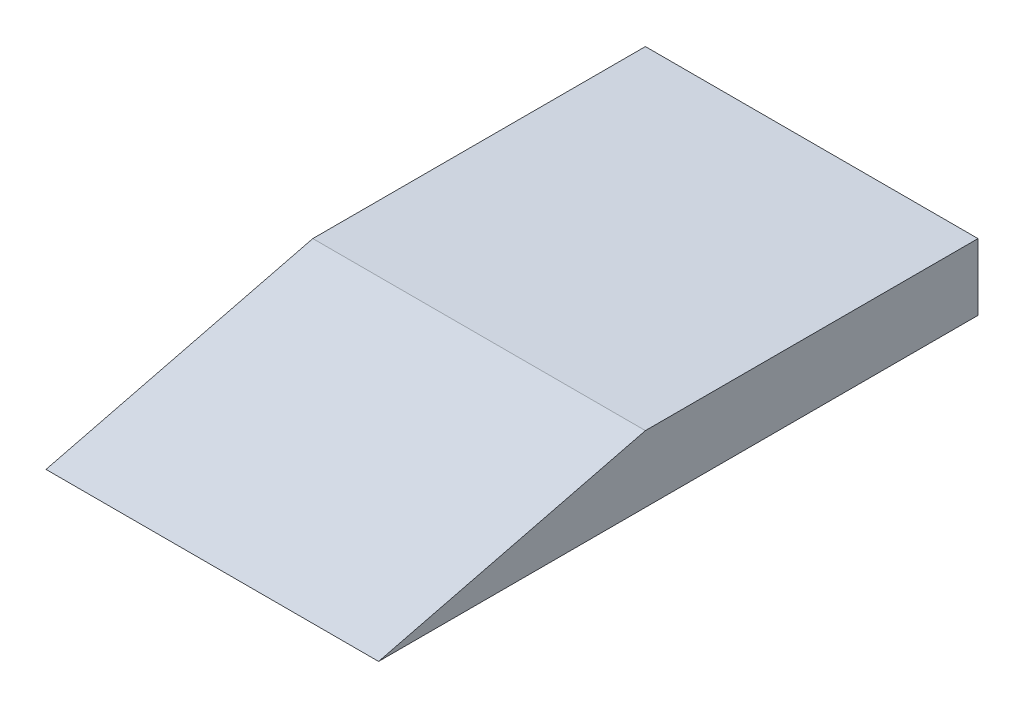
ISO-10303-21;
HEADER;
FILE_DESCRIPTION(('STEP AP214'),'2;1');
FILE_NAME('part.step','',(''),(''),'','','');
FILE_SCHEMA(('AUTOMOTIVE_DESIGN { 1 0 10303 214 1 1 1 1 }'));
ENDSEC;
DATA;
#1=APPLICATION_CONTEXT('core data for automotive mechanical design processes');
#2=APPLICATION_PROTOCOL_DEFINITION('international standard','automotive_design',2000,#1);
#3=PRODUCT_CONTEXT('',#1,'mechanical');
#4=PRODUCT('Part','Part','',(#3));
#5=PRODUCT_RELATED_PRODUCT_CATEGORY('part','',(#4));
#6=PRODUCT_DEFINITION_FORMATION('','',#4);
#7=PRODUCT_DEFINITION_CONTEXT('part definition',#1,'design');
#8=PRODUCT_DEFINITION('design','',#6,#7);
#9=PRODUCT_DEFINITION_SHAPE('','',#8);
#10=(LENGTH_UNIT() NAMED_UNIT(*) SI_UNIT(.MILLI.,.METRE.));
#11=(NAMED_UNIT(*) PLANE_ANGLE_UNIT() SI_UNIT($,.RADIAN.));
#12=(NAMED_UNIT(*) SI_UNIT($,.STERADIAN.) SOLID_ANGLE_UNIT());
#13=UNCERTAINTY_MEASURE_WITH_UNIT(LENGTH_MEASURE(1.E-05),#10,'distance_accuracy_value','');
#14=(GEOMETRIC_REPRESENTATION_CONTEXT(3) GLOBAL_UNCERTAINTY_ASSIGNED_CONTEXT((#13)) GLOBAL_UNIT_ASSIGNED_CONTEXT((#10,
#11,#12)) REPRESENTATION_CONTEXT('',''));
#15=CARTESIAN_POINT('',(0.,0.,0.));
#16=DIRECTION('',(0.,0.,1.));
#17=DIRECTION('',(1.,0.,0.));
#18=AXIS2_PLACEMENT_3D('',#15,#16,#17);
#19=CARTESIAN_POINT('',(1000.,0.,-1000.));
#20=DIRECTION('',(0.,0.,1.));
#21=DIRECTION('',(1.,0.,0.));
#22=AXIS2_PLACEMENT_3D('',#19,#20,#21);
#23=PLANE('',#22);
#24=DIRECTION('',(0.,1.,0.));
#25=VECTOR('',#24,1.);
#26=CARTESIAN_POINT('',(0.,0.,-1000.));
#27=LINE('',#26,#25);
#28=CARTESIAN_POINT('',(0.,0.,-1000.));
#29=VERTEX_POINT('',#28);
#30=CARTESIAN_POINT('',(0.,200.,-1000.));
#31=VERTEX_POINT('',#30);
#32=EDGE_CURVE('E113',#29,#31,#27,.T.);
#33=ORIENTED_EDGE('',*,*,#32,.T.);
#34=DIRECTION('',(-1.,0.,0.));
#35=VECTOR('',#34,1.);
#36=CARTESIAN_POINT('',(1000.,200.,-1000.));
#37=LINE('',#36,#35);
#38=CARTESIAN_POINT('',(1000.,200.,-1000.));
#39=VERTEX_POINT('',#38);
#40=EDGE_CURVE('E11',#39,#31,#37,.T.);
#41=ORIENTED_EDGE('',*,*,#40,.F.);
#42=DIRECTION('',(0.,1.,0.));
#43=VECTOR('',#42,1.);
#44=CARTESIAN_POINT('',(1000.,0.,-1000.));
#45=LINE('',#44,#43);
#46=CARTESIAN_POINT('',(1000.,0.,-1000.));
#47=VERTEX_POINT('',#46);
#48=EDGE_CURVE('E97',#47,#39,#45,.T.);
#49=ORIENTED_EDGE('',*,*,#48,.F.);
#50=DIRECTION('',(-1.,0.,0.));
#51=VECTOR('',#50,1.);
#52=CARTESIAN_POINT('',(1000.,0.,-1000.));
#53=LINE('',#52,#51);
#54=EDGE_CURVE('E109',#47,#29,#53,.T.);
#55=ORIENTED_EDGE('',*,*,#54,.T.);
#56=EDGE_LOOP('',(#33,#41,#49,#55));
#57=FACE_BOUND('',#56,.T.);
#58=ADVANCED_FACE('F45',(#57),#23,.F.);
#59=CARTESIAN_POINT('',(1000.,200.,0.));
#60=DIRECTION('',(0.,-1.,0.));
#61=DIRECTION('',(0.,0.,-1.));
#62=AXIS2_PLACEMENT_3D('',#59,#60,#61);
#63=PLANE('',#62);
#64=DIRECTION('',(0.,0.,1.));
#65=VECTOR('',#64,1.);
#66=CARTESIAN_POINT('',(0.,200.,0.));
#67=LINE('',#66,#65);
#68=CARTESIAN_POINT('',(0.,200.,0.));
#69=VERTEX_POINT('',#68);
#70=EDGE_CURVE('E102',#31,#69,#67,.T.);
#71=ORIENTED_EDGE('',*,*,#70,.T.);
#72=DIRECTION('',(-1.,0.,0.));
#73=VECTOR('',#72,1.);
#74=CARTESIAN_POINT('',(1000.,200.,0.));
#75=LINE('',#74,#73);
#76=CARTESIAN_POINT('',(1000.,200.,0.));
#77=VERTEX_POINT('',#76);
#78=EDGE_CURVE('E54',#77,#69,#75,.T.);
#79=ORIENTED_EDGE('',*,*,#78,.F.);
#80=DIRECTION('',(0.,0.,1.));
#81=VECTOR('',#80,1.);
#82=CARTESIAN_POINT('',(1000.,200.,0.));
#83=LINE('',#82,#81);
#84=EDGE_CURVE('E92',#39,#77,#83,.T.);
#85=ORIENTED_EDGE('',*,*,#84,.F.);
#86=ORIENTED_EDGE('',*,*,#40,.T.);
#87=EDGE_LOOP('',(#71,#79,#85,#86));
#88=FACE_BOUND('',#87,.T.);
#89=ADVANCED_FACE('F101',(#88),#63,.F.);
#90=CARTESIAN_POINT('',(1000.,200.,0.));
#91=DIRECTION('',(0.,-0.970295726275995,-0.241921895599672));
#92=DIRECTION('',(0.,0.241921895599672,-0.970295726275995));
#93=AXIS2_PLACEMENT_3D('',#90,#91,#92);
#94=PLANE('',#93);
#95=DIRECTION('',(0.,-0.241921895599672,0.970295726275995));
#96=VECTOR('',#95,1.);
#97=CARTESIAN_POINT('',(0.,200.,0.));
#98=LINE('',#97,#96);
#99=CARTESIAN_POINT('',(0.,0.,802.156186707153));
#100=VERTEX_POINT('',#99);
#101=EDGE_CURVE('E79',#69,#100,#98,.T.);
#102=ORIENTED_EDGE('',*,*,#101,.T.);
#103=DIRECTION('',(-1.,0.,0.));
#104=VECTOR('',#103,1.);
#105=CARTESIAN_POINT('',(1000.,0.,802.156186707153));
#106=LINE('',#105,#104);
#107=CARTESIAN_POINT('',(1000.,0.,802.156186707153));
#108=VERTEX_POINT('',#107);
#109=EDGE_CURVE('E104',#108,#100,#106,.T.);
#110=ORIENTED_EDGE('',*,*,#109,.F.);
#111=DIRECTION('',(0.,-0.241921895599672,0.970295726275995));
#112=VECTOR('',#111,1.);
#113=CARTESIAN_POINT('',(1000.,200.,0.));
#114=LINE('',#113,#112);
#115=EDGE_CURVE('E95',#77,#108,#114,.T.);
#116=ORIENTED_EDGE('',*,*,#115,.F.);
#117=ORIENTED_EDGE('',*,*,#78,.T.);
#118=EDGE_LOOP('',(#102,#110,#116,#117));
#119=FACE_BOUND('',#118,.T.);
#120=ADVANCED_FACE('F105',(#119),#94,.F.);
#121=CARTESIAN_POINT('',(1000.,0.,802.156186707153));
#122=DIRECTION('',(0.,1.,0.));
#123=DIRECTION('',(0.,0.,1.));
#124=AXIS2_PLACEMENT_3D('',#121,#122,#123);
#125=PLANE('',#124);
#126=DIRECTION('',(0.,0.,-1.));
#127=VECTOR('',#126,1.);
#128=CARTESIAN_POINT('',(0.,0.,802.156186707153));
#129=LINE('',#128,#127);
#130=EDGE_CURVE('E85',#100,#29,#129,.T.);
#131=ORIENTED_EDGE('',*,*,#130,.T.);
#132=ORIENTED_EDGE('',*,*,#54,.F.);
#133=DIRECTION('',(0.,0.,-1.));
#134=VECTOR('',#133,1.);
#135=CARTESIAN_POINT('',(1000.,0.,802.156186707153));
#136=LINE('',#135,#134);
#137=EDGE_CURVE('E62',#108,#47,#136,.T.);
#138=ORIENTED_EDGE('',*,*,#137,.F.);
#139=ORIENTED_EDGE('',*,*,#109,.T.);
#140=EDGE_LOOP('',(#131,#132,#138,#139));
#141=FACE_BOUND('',#140,.T.);
#142=ADVANCED_FACE('F126',(#141),#125,.F.);
#143=CARTESIAN_POINT('',(1000.,0.,0.));
#144=DIRECTION('',(-1.,0.,0.));
#145=DIRECTION('',(0.,0.,1.));
#146=AXIS2_PLACEMENT_3D('',#143,#144,#145);
#147=PLANE('',#146);
#148=ORIENTED_EDGE('',*,*,#48,.T.);
#149=ORIENTED_EDGE('',*,*,#84,.T.);
#150=ORIENTED_EDGE('',*,*,#115,.T.);
#151=ORIENTED_EDGE('',*,*,#137,.T.);
#152=EDGE_LOOP('',(#148,#149,#150,#151));
#153=FACE_BOUND('',#152,.T.);
#154=ADVANCED_FACE('F93',(#153),#147,.F.);
#155=CARTESIAN_POINT('',(0.,0.,0.));
#156=DIRECTION('',(-1.,0.,0.));
#157=DIRECTION('',(0.,0.,1.));
#158=AXIS2_PLACEMENT_3D('',#155,#156,#157);
#159=PLANE('',#158);
#160=ORIENTED_EDGE('',*,*,#32,.F.);
#161=ORIENTED_EDGE('',*,*,#130,.F.);
#162=ORIENTED_EDGE('',*,*,#101,.F.);
#163=ORIENTED_EDGE('',*,*,#70,.F.);
#164=EDGE_LOOP('',(#160,#161,#162,#163));
#165=FACE_BOUND('',#164,.T.);
#166=ADVANCED_FACE('F129',(#165),#159,.T.);
#167=CLOSED_SHELL('',(#58,#89,#120,#142,#154,#166));
#168=MANIFOLD_SOLID_BREP('B2',#167);
#169=ADVANCED_BREP_SHAPE_REPRESENTATION('',(#18,#168),#14);
#170=SHAPE_DEFINITION_REPRESENTATION(#9,#169);
ENDSEC;
END-ISO-10303-21;
